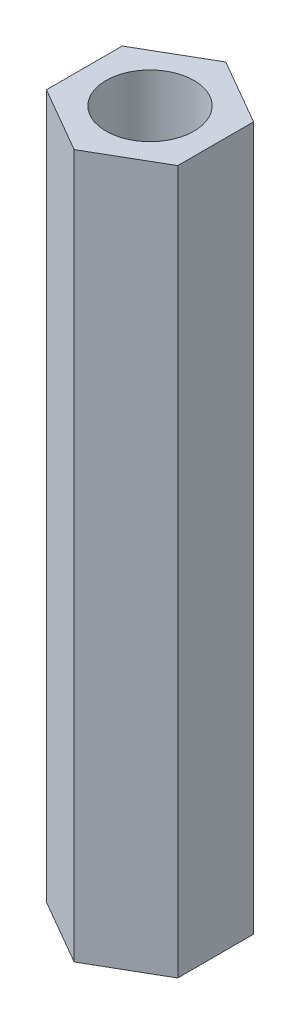
ISO-10303-21;
HEADER;
FILE_DESCRIPTION(('STEP AP214'),'2;1');
FILE_NAME('part.step','',(''),(''),'','','');
FILE_SCHEMA(('AUTOMOTIVE_DESIGN { 1 0 10303 214 1 1 1 1 }'));
ENDSEC;
DATA;
#1=APPLICATION_CONTEXT('core data for automotive mechanical design processes');
#2=APPLICATION_PROTOCOL_DEFINITION('international standard','automotive_design',2000,#1);
#3=PRODUCT_CONTEXT('',#1,'mechanical');
#4=PRODUCT('Part','Part','',(#3));
#5=PRODUCT_RELATED_PRODUCT_CATEGORY('part','',(#4));
#6=PRODUCT_DEFINITION_FORMATION('','',#4);
#7=PRODUCT_DEFINITION_CONTEXT('part definition',#1,'design');
#8=PRODUCT_DEFINITION('design','',#6,#7);
#9=PRODUCT_DEFINITION_SHAPE('','',#8);
#10=(LENGTH_UNIT() NAMED_UNIT(*) SI_UNIT(.MILLI.,.METRE.));
#11=(NAMED_UNIT(*) PLANE_ANGLE_UNIT() SI_UNIT($,.RADIAN.));
#12=(NAMED_UNIT(*) SI_UNIT($,.STERADIAN.) SOLID_ANGLE_UNIT());
#13=UNCERTAINTY_MEASURE_WITH_UNIT(LENGTH_MEASURE(1.E-05),#10,'distance_accuracy_value','');
#14=(GEOMETRIC_REPRESENTATION_CONTEXT(3) GLOBAL_UNCERTAINTY_ASSIGNED_CONTEXT((#13)) GLOBAL_UNIT_ASSIGNED_CONTEXT((#10,
#11,#12)) REPRESENTATION_CONTEXT('',''));
#15=CARTESIAN_POINT('',(0.,0.,0.));
#16=DIRECTION('',(0.,0.,1.));
#17=DIRECTION('',(1.,0.,0.));
#18=AXIS2_PLACEMENT_3D('',#15,#16,#17);
#19=CARTESIAN_POINT('',(0.,19.05,0.));
#20=DIRECTION('',(0.,1.,0.));
#21=DIRECTION('',(0.,0.,1.));
#22=AXIS2_PLACEMENT_3D('',#19,#20,#21);
#23=PLANE('',#22);
#24=DIRECTION('',(0.866025403784438,0.,0.5));
#25=VECTOR('',#24,1.);
#26=CARTESIAN_POINT('',(-1.778,19.05,1.02652877861915));
#27=LINE('',#26,#25);
#28=CARTESIAN_POINT('',(-1.778,19.05,1.02652877861915));
#29=VERTEX_POINT('',#28);
#30=CARTESIAN_POINT('',(0.,19.05,2.05305755723831));
#31=VERTEX_POINT('',#30);
#32=EDGE_CURVE('E129',#29,#31,#27,.T.);
#33=ORIENTED_EDGE('',*,*,#32,.T.);
#34=DIRECTION('',(0.866025403784439,0.,-0.5));
#35=VECTOR('',#34,1.);
#36=CARTESIAN_POINT('',(0.,19.05,2.05305755723831));
#37=LINE('',#36,#35);
#38=CARTESIAN_POINT('',(1.778,19.05,1.02652877861915));
#39=VERTEX_POINT('',#38);
#40=EDGE_CURVE('E87',#31,#39,#37,.T.);
#41=ORIENTED_EDGE('',*,*,#40,.T.);
#42=DIRECTION('',(0.,0.,-1.));
#43=VECTOR('',#42,1.);
#44=CARTESIAN_POINT('',(1.778,19.05,1.02652877861915));
#45=LINE('',#44,#43);
#46=CARTESIAN_POINT('',(1.778,19.05,-1.02652877861915));
#47=VERTEX_POINT('',#46);
#48=EDGE_CURVE('E100',#39,#47,#45,.T.);
#49=ORIENTED_EDGE('',*,*,#48,.T.);
#50=DIRECTION('',(-0.866025403784439,0.,-0.5));
#51=VECTOR('',#50,1.);
#52=CARTESIAN_POINT('',(1.778,19.05,-1.02652877861915));
#53=LINE('',#52,#51);
#54=CARTESIAN_POINT('',(0.,19.05,-2.05305755723831));
#55=VERTEX_POINT('',#54);
#56=EDGE_CURVE('E94',#47,#55,#53,.T.);
#57=ORIENTED_EDGE('',*,*,#56,.T.);
#58=DIRECTION('',(-0.866025403784439,0.,0.5));
#59=VECTOR('',#58,1.);
#60=CARTESIAN_POINT('',(0.,19.05,-2.05305755723831));
#61=LINE('',#60,#59);
#62=CARTESIAN_POINT('',(-1.778,19.05,-1.02652877861915));
#63=VERTEX_POINT('',#62);
#64=EDGE_CURVE('E98',#55,#63,#61,.T.);
#65=ORIENTED_EDGE('',*,*,#64,.T.);
#66=DIRECTION('',(0.,0.,1.));
#67=VECTOR('',#66,1.);
#68=CARTESIAN_POINT('',(-1.778,19.05,-1.02652877861915));
#69=LINE('',#68,#67);
#70=EDGE_CURVE('E50',#63,#29,#69,.T.);
#71=ORIENTED_EDGE('',*,*,#70,.T.);
#72=EDGE_LOOP('',(#33,#41,#49,#57,#65,#71));
#73=FACE_BOUND('',#72,.T.);
#74=CARTESIAN_POINT('',(0.,19.05,0.));
#75=DIRECTION('',(0.,1.,0.));
#76=DIRECTION('',(0.,0.,1.));
#77=AXIS2_PLACEMENT_3D('',#74,#75,#76);
#78=CIRCLE('',#77,1.190625);
#79=CARTESIAN_POINT('',(0.,19.05,-1.190625));
#80=VERTEX_POINT('',#79);
#81=EDGE_CURVE('E122',#80,#80,#78,.T.);
#82=ORIENTED_EDGE('',*,*,#81,.F.);
#83=EDGE_LOOP('',(#82));
#84=FACE_BOUND('',#83,.T.);
#85=ADVANCED_FACE('F33',(#73,#84),#23,.T.);
#86=CARTESIAN_POINT('',(0.,0.,0.));
#87=DIRECTION('',(0.,1.,0.));
#88=DIRECTION('',(0.,0.,1.));
#89=AXIS2_PLACEMENT_3D('',#86,#87,#88);
#90=PLANE('',#89);
#91=DIRECTION('',(0.866025403784438,0.,0.5));
#92=VECTOR('',#91,1.);
#93=CARTESIAN_POINT('',(-1.778,0.,1.02652877861915));
#94=LINE('',#93,#92);
#95=CARTESIAN_POINT('',(-1.778,0.,1.02652877861915));
#96=VERTEX_POINT('',#95);
#97=CARTESIAN_POINT('',(0.,0.,2.05305755723831));
#98=VERTEX_POINT('',#97);
#99=EDGE_CURVE('E118',#96,#98,#94,.T.);
#100=ORIENTED_EDGE('',*,*,#99,.F.);
#101=DIRECTION('',(0.,0.,1.));
#102=VECTOR('',#101,1.);
#103=CARTESIAN_POINT('',(-1.778,0.,-1.02652877861915));
#104=LINE('',#103,#102);
#105=CARTESIAN_POINT('',(-1.778,0.,-1.02652877861915));
#106=VERTEX_POINT('',#105);
#107=EDGE_CURVE('E79',#106,#96,#104,.T.);
#108=ORIENTED_EDGE('',*,*,#107,.F.);
#109=DIRECTION('',(-0.866025403784439,0.,0.5));
#110=VECTOR('',#109,1.);
#111=CARTESIAN_POINT('',(0.,0.,-2.05305755723831));
#112=LINE('',#111,#110);
#113=CARTESIAN_POINT('',(0.,0.,-2.05305755723831));
#114=VERTEX_POINT('',#113);
#115=EDGE_CURVE('E73',#114,#106,#112,.T.);
#116=ORIENTED_EDGE('',*,*,#115,.F.);
#117=DIRECTION('',(-0.866025403784439,0.,-0.5));
#118=VECTOR('',#117,1.);
#119=CARTESIAN_POINT('',(1.778,0.,-1.02652877861915));
#120=LINE('',#119,#118);
#121=CARTESIAN_POINT('',(1.778,0.,-1.02652877861915));
#122=VERTEX_POINT('',#121);
#123=EDGE_CURVE('E108',#122,#114,#120,.T.);
#124=ORIENTED_EDGE('',*,*,#123,.F.);
#125=DIRECTION('',(0.,0.,-1.));
#126=VECTOR('',#125,1.);
#127=CARTESIAN_POINT('',(1.778,0.,1.02652877861915));
#128=LINE('',#127,#126);
#129=CARTESIAN_POINT('',(1.778,0.,1.02652877861915));
#130=VERTEX_POINT('',#129);
#131=EDGE_CURVE('E124',#130,#122,#128,.T.);
#132=ORIENTED_EDGE('',*,*,#131,.F.);
#133=DIRECTION('',(0.866025403784439,0.,-0.5));
#134=VECTOR('',#133,1.);
#135=CARTESIAN_POINT('',(0.,0.,2.05305755723831));
#136=LINE('',#135,#134);
#137=EDGE_CURVE('E121',#98,#130,#136,.T.);
#138=ORIENTED_EDGE('',*,*,#137,.F.);
#139=EDGE_LOOP('',(#100,#108,#116,#124,#132,#138));
#140=FACE_BOUND('',#139,.T.);
#141=CARTESIAN_POINT('',(0.,0.,0.));
#142=DIRECTION('',(0.,1.,0.));
#143=DIRECTION('',(0.,0.,1.));
#144=AXIS2_PLACEMENT_3D('',#141,#142,#143);
#145=CIRCLE('',#144,1.190625);
#146=CARTESIAN_POINT('',(0.,0.,-1.190625));
#147=VERTEX_POINT('',#146);
#148=EDGE_CURVE('E222',#147,#147,#145,.T.);
#149=ORIENTED_EDGE('',*,*,#148,.T.);
#150=EDGE_LOOP('',(#149));
#151=FACE_BOUND('',#150,.T.);
#152=ADVANCED_FACE('F138',(#140,#151),#90,.F.);
#153=CARTESIAN_POINT('',(-1.778,19.05,1.02652877861915));
#154=DIRECTION('',(0.5,0.,-0.866025403784439));
#155=DIRECTION('',(-0.866025403784438,0.,-0.5));
#156=AXIS2_PLACEMENT_3D('',#153,#154,#155);
#157=PLANE('',#156);
#158=ORIENTED_EDGE('',*,*,#99,.T.);
#159=DIRECTION('',(0.,-1.,0.));
#160=VECTOR('',#159,1.);
#161=CARTESIAN_POINT('',(0.,19.05,2.05305755723831));
#162=LINE('',#161,#160);
#163=EDGE_CURVE('E11',#31,#98,#162,.T.);
#164=ORIENTED_EDGE('',*,*,#163,.F.);
#165=ORIENTED_EDGE('',*,*,#32,.F.);
#166=DIRECTION('',(0.,-1.,0.));
#167=VECTOR('',#166,1.);
#168=CARTESIAN_POINT('',(-1.778,19.05,1.02652877861915));
#169=LINE('',#168,#167);
#170=EDGE_CURVE('E114',#29,#96,#169,.T.);
#171=ORIENTED_EDGE('',*,*,#170,.T.);
#172=EDGE_LOOP('',(#158,#164,#165,#171));
#173=FACE_BOUND('',#172,.T.);
#174=ADVANCED_FACE('F35',(#173),#157,.F.);
#175=CARTESIAN_POINT('',(0.,19.05,2.05305755723831));
#176=DIRECTION('',(-0.5,0.,-0.866025403784439));
#177=DIRECTION('',(-0.866025403784439,0.,0.5));
#178=AXIS2_PLACEMENT_3D('',#175,#176,#177);
#179=PLANE('',#178);
#180=ORIENTED_EDGE('',*,*,#137,.T.);
#181=DIRECTION('',(0.,-1.,0.));
#182=VECTOR('',#181,1.);
#183=CARTESIAN_POINT('',(1.778,19.05,1.02652877861915));
#184=LINE('',#183,#182);
#185=EDGE_CURVE('E42',#39,#130,#184,.T.);
#186=ORIENTED_EDGE('',*,*,#185,.F.);
#187=ORIENTED_EDGE('',*,*,#40,.F.);
#188=ORIENTED_EDGE('',*,*,#163,.T.);
#189=EDGE_LOOP('',(#180,#186,#187,#188));
#190=FACE_BOUND('',#189,.T.);
#191=ADVANCED_FACE('F163',(#190),#179,.F.);
#192=CARTESIAN_POINT('',(1.778,19.05,1.02652877861915));
#193=DIRECTION('',(-1.,0.,0.));
#194=DIRECTION('',(0.,0.,1.));
#195=AXIS2_PLACEMENT_3D('',#192,#193,#194);
#196=PLANE('',#195);
#197=ORIENTED_EDGE('',*,*,#131,.T.);
#198=DIRECTION('',(0.,-1.,0.));
#199=VECTOR('',#198,1.);
#200=CARTESIAN_POINT('',(1.778,19.05,-1.02652877861915));
#201=LINE('',#200,#199);
#202=EDGE_CURVE('E109',#47,#122,#201,.T.);
#203=ORIENTED_EDGE('',*,*,#202,.F.);
#204=ORIENTED_EDGE('',*,*,#48,.F.);
#205=ORIENTED_EDGE('',*,*,#185,.T.);
#206=EDGE_LOOP('',(#197,#203,#204,#205));
#207=FACE_BOUND('',#206,.T.);
#208=ADVANCED_FACE('F135',(#207),#196,.F.);
#209=CARTESIAN_POINT('',(1.778,19.05,-1.02652877861915));
#210=DIRECTION('',(-0.5,0.,0.866025403784439));
#211=DIRECTION('',(0.866025403784438,0.,0.5));
#212=AXIS2_PLACEMENT_3D('',#209,#210,#211);
#213=PLANE('',#212);
#214=ORIENTED_EDGE('',*,*,#123,.T.);
#215=DIRECTION('',(0.,-1.,0.));
#216=VECTOR('',#215,1.);
#217=CARTESIAN_POINT('',(0.,19.05,-2.05305755723831));
#218=LINE('',#217,#216);
#219=EDGE_CURVE('E105',#55,#114,#218,.T.);
#220=ORIENTED_EDGE('',*,*,#219,.F.);
#221=ORIENTED_EDGE('',*,*,#56,.F.);
#222=ORIENTED_EDGE('',*,*,#202,.T.);
#223=EDGE_LOOP('',(#214,#220,#221,#222));
#224=FACE_BOUND('',#223,.T.);
#225=ADVANCED_FACE('F106',(#224),#213,.F.);
#226=CARTESIAN_POINT('',(0.,19.05,-2.05305755723831));
#227=DIRECTION('',(0.5,0.,0.866025403784439));
#228=DIRECTION('',(0.866025403784439,0.,-0.5));
#229=AXIS2_PLACEMENT_3D('',#226,#227,#228);
#230=PLANE('',#229);
#231=ORIENTED_EDGE('',*,*,#115,.T.);
#232=DIRECTION('',(0.,-1.,0.));
#233=VECTOR('',#232,1.);
#234=CARTESIAN_POINT('',(-1.778,19.05,-1.02652877861915));
#235=LINE('',#234,#233);
#236=EDGE_CURVE('E110',#63,#106,#235,.T.);
#237=ORIENTED_EDGE('',*,*,#236,.F.);
#238=ORIENTED_EDGE('',*,*,#64,.F.);
#239=ORIENTED_EDGE('',*,*,#219,.T.);
#240=EDGE_LOOP('',(#231,#237,#238,#239));
#241=FACE_BOUND('',#240,.T.);
#242=ADVANCED_FACE('F112',(#241),#230,.F.);
#243=CARTESIAN_POINT('',(-1.778,19.05,-1.02652877861915));
#244=DIRECTION('',(1.,0.,0.));
#245=DIRECTION('',(0.,0.,-1.));
#246=AXIS2_PLACEMENT_3D('',#243,#244,#245);
#247=PLANE('',#246);
#248=ORIENTED_EDGE('',*,*,#107,.T.);
#249=ORIENTED_EDGE('',*,*,#170,.F.);
#250=ORIENTED_EDGE('',*,*,#70,.F.);
#251=ORIENTED_EDGE('',*,*,#236,.T.);
#252=EDGE_LOOP('',(#248,#249,#250,#251));
#253=FACE_BOUND('',#252,.T.);
#254=ADVANCED_FACE('F143',(#253),#247,.F.);
#255=CARTESIAN_POINT('',(0.,19.05,0.));
#256=DIRECTION('',(0.,-1.,0.));
#257=DIRECTION('',(0.,0.,-1.));
#258=AXIS2_PLACEMENT_3D('',#255,#256,#257);
#259=CYLINDRICAL_SURFACE('',#258,1.190625);
#260=CARTESIAN_POINT('',(0.,19.05,-1.190625));
#261=CARTESIAN_POINT('',(0.,18.8515625,-1.190625));
#262=CARTESIAN_POINT('',(0.,18.653125,-1.190625));
#263=CARTESIAN_POINT('',(0.,18.25625,-1.190625));
#264=CARTESIAN_POINT('',(0.,18.0578125,-1.190625));
#265=CARTESIAN_POINT('',(0.,17.6609375,-1.190625));
#266=CARTESIAN_POINT('',(0.,17.4625,-1.190625));
#267=CARTESIAN_POINT('',(0.,17.065625,-1.190625));
#268=CARTESIAN_POINT('',(0.,16.8671875,-1.190625));
#269=CARTESIAN_POINT('',(0.,16.4703125,-1.190625));
#270=CARTESIAN_POINT('',(0.,16.271875,-1.190625));
#271=CARTESIAN_POINT('',(0.,15.875,-1.190625));
#272=CARTESIAN_POINT('',(0.,15.6765625,-1.190625));
#273=CARTESIAN_POINT('',(0.,15.2796875,-1.190625));
#274=CARTESIAN_POINT('',(0.,15.08125,-1.190625));
#275=CARTESIAN_POINT('',(0.,14.684375,-1.190625));
#276=CARTESIAN_POINT('',(0.,14.4859375,-1.190625));
#277=CARTESIAN_POINT('',(0.,14.0890625,-1.190625));
#278=CARTESIAN_POINT('',(0.,13.890625,-1.190625));
#279=CARTESIAN_POINT('',(0.,13.49375,-1.190625));
#280=CARTESIAN_POINT('',(0.,13.2953125,-1.190625));
#281=CARTESIAN_POINT('',(0.,12.8984375,-1.190625));
#282=CARTESIAN_POINT('',(0.,12.7,-1.190625));
#283=CARTESIAN_POINT('',(0.,12.303125,-1.190625));
#284=CARTESIAN_POINT('',(0.,12.1046875,-1.190625));
#285=CARTESIAN_POINT('',(0.,11.7078125,-1.190625));
#286=CARTESIAN_POINT('',(0.,11.509375,-1.190625));
#287=CARTESIAN_POINT('',(0.,11.1125,-1.190625));
#288=CARTESIAN_POINT('',(0.,10.9140625,-1.190625));
#289=CARTESIAN_POINT('',(0.,10.5171875,-1.190625));
#290=CARTESIAN_POINT('',(0.,10.31875,-1.190625));
#291=CARTESIAN_POINT('',(0.,9.921875,-1.190625));
#292=CARTESIAN_POINT('',(0.,9.7234375,-1.190625));
#293=CARTESIAN_POINT('',(0.,9.3265625,-1.190625));
#294=CARTESIAN_POINT('',(0.,9.128125,-1.190625));
#295=CARTESIAN_POINT('',(0.,8.73125,-1.190625));
#296=CARTESIAN_POINT('',(0.,8.5328125,-1.190625));
#297=CARTESIAN_POINT('',(0.,8.1359375,-1.190625));
#298=CARTESIAN_POINT('',(0.,7.9375,-1.190625));
#299=CARTESIAN_POINT('',(0.,7.540625,-1.190625));
#300=CARTESIAN_POINT('',(0.,7.3421875,-1.190625));
#301=CARTESIAN_POINT('',(0.,6.9453125,-1.190625));
#302=CARTESIAN_POINT('',(0.,6.746875,-1.190625));
#303=CARTESIAN_POINT('',(0.,6.35,-1.190625));
#304=CARTESIAN_POINT('',(0.,6.1515625,-1.190625));
#305=CARTESIAN_POINT('',(0.,5.7546875,-1.190625));
#306=CARTESIAN_POINT('',(0.,5.55625,-1.190625));
#307=CARTESIAN_POINT('',(0.,5.159375,-1.190625));
#308=CARTESIAN_POINT('',(0.,4.9609375,-1.190625));
#309=CARTESIAN_POINT('',(0.,4.5640625,-1.190625));
#310=CARTESIAN_POINT('',(0.,4.365625,-1.190625));
#311=CARTESIAN_POINT('',(0.,3.96875,-1.190625));
#312=CARTESIAN_POINT('',(0.,3.7703125,-1.190625));
#313=CARTESIAN_POINT('',(0.,3.3734375,-1.190625));
#314=CARTESIAN_POINT('',(0.,3.175,-1.190625));
#315=CARTESIAN_POINT('',(0.,2.778125,-1.190625));
#316=CARTESIAN_POINT('',(0.,2.5796875,-1.190625));
#317=CARTESIAN_POINT('',(0.,2.1828125,-1.190625));
#318=CARTESIAN_POINT('',(0.,1.984375,-1.190625));
#319=CARTESIAN_POINT('',(0.,1.5875,-1.190625));
#320=CARTESIAN_POINT('',(0.,1.3890625,-1.190625));
#321=CARTESIAN_POINT('',(0.,0.992187500000001,-1.190625));
#322=CARTESIAN_POINT('',(0.,0.793750000000001,-1.190625));
#323=CARTESIAN_POINT('',(0.,0.396875,-1.190625));
#324=CARTESIAN_POINT('',(0.,0.1984375,-1.190625));
#325=CARTESIAN_POINT('',(0.,0.,-1.190625));
#326=B_SPLINE_CURVE_WITH_KNOTS('',3,(#260,#261,#262,#263,#264,#265,#266,#267,#268,#269,#270,
#271,#272,#273,#274,#275,#276,#277,#278,#279,#280,#281,#282,#283,#284,#285,#286,#287,#288,#289,
#290,#291,#292,#293,#294,#295,#296,#297,#298,#299,#300,#301,#302,#303,#304,#305,#306,#307,#308,
#309,#310,#311,#312,#313,#314,#315,#316,#317,#318,#319,#320,#321,#322,#323,#324,#325),
.UNSPECIFIED.,.F.,.F.,(4,2,2,2,2,2,2,2,2,2,2,2,2,2,2,2,2,2,2,2,2,2,2,2,2,2,2,2,2,2,2,2,4),(0.,
0.5953125,1.190625,1.7859375,2.38125,2.9765625,3.571875,4.1671875,4.7625,5.3578125,5.953125,
6.5484375,7.14375,7.7390625,8.334375,8.9296875,9.525,10.1203125,10.715625,11.3109375,11.90625,
12.5015625,13.096875,13.6921875,14.2875,14.8828125,15.478125,16.0734375,16.66875,17.2640625,
17.859375,18.4546875,19.05),.UNSPECIFIED.);
#327=EDGE_CURVE('BSEAM145',#80,#147,#326,.T.);
#328=ORIENTED_EDGE('',*,*,#81,.T.);
#329=ORIENTED_EDGE('',*,*,#148,.F.);
#330=ORIENTED_EDGE('',*,*,#327,.T.);
#331=ORIENTED_EDGE('',*,*,#327,.F.);
#332=EDGE_LOOP('',(#328,#330,#329,#331));
#333=FACE_BOUND('',#332,.T.);
#334=ADVANCED_FACE('F145',(#333),#259,.F.);
#335=CLOSED_SHELL('',(#85,#152,#174,#191,#208,#225,#242,#254,#334));
#336=MANIFOLD_SOLID_BREP('B2',#335);
#337=ADVANCED_BREP_SHAPE_REPRESENTATION('',(#18,#336),#14);
#338=SHAPE_DEFINITION_REPRESENTATION(#9,#337);
ENDSEC;
END-ISO-10303-21;
